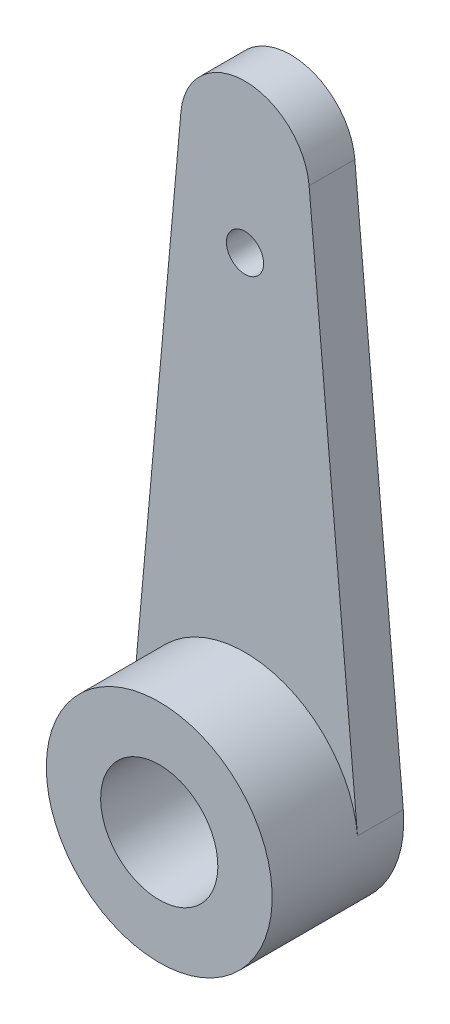
ISO-10303-21;
HEADER;
FILE_DESCRIPTION(('STEP AP214'),'2;1');
FILE_NAME('part.step','',(''),(''),'','','');
FILE_SCHEMA(('AUTOMOTIVE_DESIGN { 1 0 10303 214 1 1 1 1 }'));
ENDSEC;
DATA;
#1=APPLICATION_CONTEXT('core data for automotive mechanical design processes');
#2=APPLICATION_PROTOCOL_DEFINITION('international standard','automotive_design',2000,#1);
#3=PRODUCT_CONTEXT('',#1,'mechanical');
#4=PRODUCT('Part','Part','',(#3));
#5=PRODUCT_RELATED_PRODUCT_CATEGORY('part','',(#4));
#6=PRODUCT_DEFINITION_FORMATION('','',#4);
#7=PRODUCT_DEFINITION_CONTEXT('part definition',#1,'design');
#8=PRODUCT_DEFINITION('design','',#6,#7);
#9=PRODUCT_DEFINITION_SHAPE('','',#8);
#10=(LENGTH_UNIT() NAMED_UNIT(*) SI_UNIT(.MILLI.,.METRE.));
#11=(NAMED_UNIT(*) PLANE_ANGLE_UNIT() SI_UNIT($,.RADIAN.));
#12=(NAMED_UNIT(*) SI_UNIT($,.STERADIAN.) SOLID_ANGLE_UNIT());
#13=UNCERTAINTY_MEASURE_WITH_UNIT(LENGTH_MEASURE(1.E-05),#10,'distance_accuracy_value','');
#14=(GEOMETRIC_REPRESENTATION_CONTEXT(3) GLOBAL_UNCERTAINTY_ASSIGNED_CONTEXT((#13)) GLOBAL_UNIT_ASSIGNED_CONTEXT((#10,
#11,#12)) REPRESENTATION_CONTEXT('',''));
#15=CARTESIAN_POINT('',(0.,0.,0.));
#16=DIRECTION('',(0.,0.,1.));
#17=DIRECTION('',(1.,0.,0.));
#18=AXIS2_PLACEMENT_3D('',#15,#16,#17);
#19=CARTESIAN_POINT('',(0.,0.,0.6));
#20=DIRECTION('',(0.,0.,1.));
#21=DIRECTION('',(0.,1.,0.));
#22=AXIS2_PLACEMENT_3D('',#19,#20,#21);
#23=CYLINDRICAL_SURFACE('',#22,2.05);
#24=CARTESIAN_POINT('',(0.,0.,4.6));
#25=DIRECTION('',(0.,0.,-1.));
#26=DIRECTION('',(0.,1.,0.));
#27=AXIS2_PLACEMENT_3D('',#24,#25,#26);
#28=CIRCLE('',#27,2.05);
#29=CARTESIAN_POINT('',(0.,2.05,4.6));
#30=VERTEX_POINT('',#29);
#31=EDGE_CURVE('E27',#30,#30,#28,.T.);
#32=ORIENTED_EDGE('',*,*,#31,.F.);
#33=EDGE_LOOP('',(#32));
#34=FACE_BOUND('',#33,.T.);
#35=CARTESIAN_POINT('',(0.,0.,1.6));
#36=DIRECTION('',(0.,0.,-1.));
#37=DIRECTION('',(0.,1.,0.));
#38=AXIS2_PLACEMENT_3D('',#35,#36,#37);
#39=CIRCLE('',#38,2.05);
#40=CARTESIAN_POINT('',(0.,2.05,1.6));
#41=VERTEX_POINT('',#40);
#42=EDGE_CURVE('E11',#41,#41,#39,.T.);
#43=ORIENTED_EDGE('',*,*,#42,.T.);
#44=EDGE_LOOP('',(#43));
#45=FACE_BOUND('',#44,.T.);
#46=ADVANCED_FACE('F16',(#34,#45),#23,.F.);
#47=CARTESIAN_POINT('',(0.,0.,1.6));
#48=DIRECTION('',(0.,0.,1.));
#49=DIRECTION('',(1.,0.,0.));
#50=AXIS2_PLACEMENT_3D('',#47,#48,#49);
#51=PLANE('',#50);
#52=CARTESIAN_POINT('',(0.,0.,1.6));
#53=DIRECTION('',(0.,0.,-1.));
#54=DIRECTION('',(0.,1.,0.));
#55=AXIS2_PLACEMENT_3D('',#52,#53,#54);
#56=CIRCLE('',#55,1.3);
#57=CARTESIAN_POINT('',(0.,1.3,1.6));
#58=VERTEX_POINT('',#57);
#59=EDGE_CURVE('E156',#58,#58,#56,.T.);
#60=ORIENTED_EDGE('',*,*,#59,.T.);
#61=EDGE_LOOP('',(#60));
#62=FACE_BOUND('',#61,.T.);
#63=ORIENTED_EDGE('',*,*,#42,.F.);
#64=EDGE_LOOP('',(#63));
#65=FACE_BOUND('',#64,.T.);
#66=ADVANCED_FACE('F244',(#62,#65),#51,.T.);
#67=CARTESIAN_POINT('',(0.,0.,4.6));
#68=DIRECTION('',(0.,0.,1.));
#69=DIRECTION('',(1.,0.,0.));
#70=AXIS2_PLACEMENT_3D('',#67,#68,#69);
#71=PLANE('',#70);
#72=ORIENTED_EDGE('',*,*,#31,.T.);
#73=EDGE_LOOP('',(#72));
#74=FACE_BOUND('',#73,.T.);
#75=CARTESIAN_POINT('',(0.,0.,4.6));
#76=DIRECTION('',(0.,0.,1.));
#77=DIRECTION('',(-1.,0.,0.));
#78=AXIS2_PLACEMENT_3D('',#75,#76,#77);
#79=CIRCLE('',#78,3.95);
#80=CARTESIAN_POINT('',(-3.95,0.,4.6));
#81=VERTEX_POINT('',#80);
#82=EDGE_CURVE('E20',#81,#81,#79,.T.);
#83=ORIENTED_EDGE('',*,*,#82,.T.);
#84=EDGE_LOOP('',(#83));
#85=FACE_BOUND('',#84,.T.);
#86=ADVANCED_FACE('F238',(#74,#85),#71,.T.);
#87=CARTESIAN_POINT('',(0.,0.,0.));
#88=DIRECTION('',(0.,0.,1.));
#89=DIRECTION('',(0.,1.,0.));
#90=AXIS2_PLACEMENT_3D('',#87,#88,#89);
#91=CYLINDRICAL_SURFACE('',#90,1.3);
#92=ORIENTED_EDGE('',*,*,#59,.F.);
#93=EDGE_LOOP('',(#92));
#94=FACE_BOUND('',#93,.T.);
#95=CARTESIAN_POINT('',(0.,0.,0.));
#96=DIRECTION('',(0.,0.,1.));
#97=DIRECTION('',(0.,1.,0.));
#98=AXIS2_PLACEMENT_3D('',#95,#96,#97);
#99=CIRCLE('',#98,1.3);
#100=CARTESIAN_POINT('',(0.,1.3,0.));
#101=VERTEX_POINT('',#100);
#102=EDGE_CURVE('E149',#101,#101,#99,.T.);
#103=ORIENTED_EDGE('',*,*,#102,.F.);
#104=EDGE_LOOP('',(#103));
#105=FACE_BOUND('',#104,.T.);
#106=ADVANCED_FACE('F243',(#94,#105),#91,.F.);
#107=CARTESIAN_POINT('',(-2.24097566986092,19.2013157894737,0.));
#108=DIRECTION('',(-0.995989186604852,0.0894736842105264,0.));
#109=DIRECTION('',(0.,0.,1.));
#110=AXIS2_PLACEMENT_3D('',#107,#108,#109);
#111=PLANE('',#110);
#112=DIRECTION('',(-0.0894736842105264,-0.995989186604852,0.));
#113=VECTOR('',#112,1.);
#114=CARTESIAN_POINT('',(-2.24097566986092,19.2013157894737,0.));
#115=LINE('',#114,#113);
#116=CARTESIAN_POINT('',(-2.24097566986091,19.2013157894737,0.));
#117=VERTEX_POINT('',#116);
#118=CARTESIAN_POINT('',(-3.93415728708917,0.353421052631578,0.));
#119=VERTEX_POINT('',#118);
#120=EDGE_CURVE('E148',#117,#119,#115,.T.);
#121=ORIENTED_EDGE('',*,*,#120,.T.);
#122=DIRECTION('',(0.,0.,1.));
#123=VECTOR('',#122,1.);
#124=CARTESIAN_POINT('',(-3.93415728708917,0.353421052631579,0.));
#125=LINE('',#124,#123);
#126=CARTESIAN_POINT('',(-3.93415728708917,0.35342105263158,1.6));
#127=VERTEX_POINT('',#126);
#128=EDGE_CURVE('E107',#119,#127,#125,.T.);
#129=ORIENTED_EDGE('',*,*,#128,.T.);
#130=DIRECTION('',(-0.0894736842105264,-0.995989186604852,0.));
#131=VECTOR('',#130,1.);
#132=CARTESIAN_POINT('',(-2.24097566986092,19.2013157894737,1.6));
#133=LINE('',#132,#131);
#134=CARTESIAN_POINT('',(-2.24097566986091,19.2013157894737,1.6));
#135=VERTEX_POINT('',#134);
#136=EDGE_CURVE('E131',#135,#127,#133,.T.);
#137=ORIENTED_EDGE('',*,*,#136,.F.);
#138=DIRECTION('',(0.,0.,1.));
#139=VECTOR('',#138,1.);
#140=CARTESIAN_POINT('',(-2.24097566986091,19.2013157894737,0.));
#141=LINE('',#140,#139);
#142=EDGE_CURVE('E97',#117,#135,#141,.T.);
#143=ORIENTED_EDGE('',*,*,#142,.F.);
#144=EDGE_LOOP('',(#121,#129,#137,#143));
#145=FACE_BOUND('',#144,.T.);
#146=ADVANCED_FACE('F280',(#145),#111,.T.);
#147=CARTESIAN_POINT('',(0.,19.,0.));
#148=DIRECTION('',(0.,0.,1.));
#149=DIRECTION('',(0.995989186604852,0.0894736842105268,0.));
#150=AXIS2_PLACEMENT_3D('',#147,#148,#149);
#151=CYLINDRICAL_SURFACE('',#150,2.25);
#152=CARTESIAN_POINT('',(0.,19.,0.));
#153=DIRECTION('',(0.,0.,1.));
#154=DIRECTION('',(0.995989186604852,0.0894736842105269,0.));
#155=AXIS2_PLACEMENT_3D('',#152,#153,#154);
#156=CIRCLE('',#155,2.25);
#157=CARTESIAN_POINT('',(2.24097566986092,19.2013157894737,0.));
#158=VERTEX_POINT('',#157);
#159=EDGE_CURVE('E145',#158,#117,#156,.T.);
#160=ORIENTED_EDGE('',*,*,#159,.T.);
#161=ORIENTED_EDGE('',*,*,#142,.T.);
#162=CARTESIAN_POINT('',(0.,19.,1.6));
#163=DIRECTION('',(0.,0.,1.));
#164=DIRECTION('',(0.995989186604852,0.0894736842105269,0.));
#165=AXIS2_PLACEMENT_3D('',#162,#163,#164);
#166=CIRCLE('',#165,2.25);
#167=CARTESIAN_POINT('',(2.24097566986092,19.2013157894737,1.6));
#168=VERTEX_POINT('',#167);
#169=EDGE_CURVE('E127',#168,#135,#166,.T.);
#170=ORIENTED_EDGE('',*,*,#169,.F.);
#171=DIRECTION('',(0.,0.,1.));
#172=VECTOR('',#171,1.);
#173=CARTESIAN_POINT('',(2.24097566986092,19.2013157894737,0.));
#174=LINE('',#173,#172);
#175=EDGE_CURVE('E115',#158,#168,#174,.T.);
#176=ORIENTED_EDGE('',*,*,#175,.F.);
#177=EDGE_LOOP('',(#160,#161,#170,#176));
#178=FACE_BOUND('',#177,.T.);
#179=ADVANCED_FACE('F128',(#178),#151,.T.);
#180=CARTESIAN_POINT('',(3.93415728708917,0.353421052631579,0.));
#181=DIRECTION('',(0.995989186604852,0.0894736842105262,0.));
#182=DIRECTION('',(0.,0.,-1.));
#183=AXIS2_PLACEMENT_3D('',#180,#181,#182);
#184=PLANE('',#183);
#185=DIRECTION('',(-0.0894736842105262,0.995989186604852,0.));
#186=VECTOR('',#185,1.);
#187=CARTESIAN_POINT('',(3.93415728708917,0.353421052631579,0.));
#188=LINE('',#187,#186);
#189=CARTESIAN_POINT('',(3.93415728708917,0.353421052631577,0.));
#190=VERTEX_POINT('',#189);
#191=EDGE_CURVE('E122',#190,#158,#188,.T.);
#192=ORIENTED_EDGE('',*,*,#191,.T.);
#193=ORIENTED_EDGE('',*,*,#175,.T.);
#194=DIRECTION('',(-0.0894736842105262,0.995989186604852,0.));
#195=VECTOR('',#194,1.);
#196=CARTESIAN_POINT('',(3.93415728708917,0.353421052631579,1.6));
#197=LINE('',#196,#195);
#198=CARTESIAN_POINT('',(3.93415728708917,0.353421052631576,1.6));
#199=VERTEX_POINT('',#198);
#200=EDGE_CURVE('E119',#199,#168,#197,.T.);
#201=ORIENTED_EDGE('',*,*,#200,.F.);
#202=DIRECTION('',(0.,0.,1.));
#203=VECTOR('',#202,1.);
#204=CARTESIAN_POINT('',(3.93415728708917,0.353421052631576,0.));
#205=LINE('',#204,#203);
#206=EDGE_CURVE('E54',#190,#199,#205,.T.);
#207=ORIENTED_EDGE('',*,*,#206,.F.);
#208=EDGE_LOOP('',(#192,#193,#201,#207));
#209=FACE_BOUND('',#208,.T.);
#210=ADVANCED_FACE('F117',(#209),#184,.T.);
#211=CARTESIAN_POINT('',(0.,0.,0.));
#212=DIRECTION('',(0.,0.,1.));
#213=DIRECTION('',(-1.,0.,0.));
#214=AXIS2_PLACEMENT_3D('',#211,#212,#213);
#215=CYLINDRICAL_SURFACE('',#214,3.95);
#216=CARTESIAN_POINT('',(0.,0.,1.6));
#217=DIRECTION('',(0.,0.,-1.));
#218=DIRECTION('',(0.995989186604852,0.0894736842105249,0.));
#219=AXIS2_PLACEMENT_3D('',#216,#217,#218);
#220=CIRCLE('',#219,3.95);
#221=EDGE_CURVE('E134',#127,#199,#220,.T.);
#222=ORIENTED_EDGE('',*,*,#221,.F.);
#223=ORIENTED_EDGE('',*,*,#128,.F.);
#224=CARTESIAN_POINT('',(0.,0.,0.));
#225=DIRECTION('',(0.,0.,1.));
#226=DIRECTION('',(-0.995989186604852,0.0894736842105256,0.));
#227=AXIS2_PLACEMENT_3D('',#224,#225,#226);
#228=CIRCLE('',#227,3.95);
#229=CARTESIAN_POINT('',(-3.95,0.,0.));
#230=VERTEX_POINT('',#229);
#231=EDGE_CURVE('E173',#119,#230,#228,.T.);
#232=ORIENTED_EDGE('',*,*,#231,.T.);
#233=CARTESIAN_POINT('',(0.,0.,0.));
#234=DIRECTION('',(0.,0.,1.));
#235=DIRECTION('',(-1.,0.,0.));
#236=AXIS2_PLACEMENT_3D('',#233,#234,#235);
#237=CIRCLE('',#236,3.95);
#238=EDGE_CURVE('E161',#230,#190,#237,.T.);
#239=ORIENTED_EDGE('',*,*,#238,.T.);
#240=ORIENTED_EDGE('',*,*,#206,.T.);
#241=EDGE_LOOP('',(#222,#223,#232,#239,#240));
#242=FACE_BOUND('',#241,.T.);
#243=ORIENTED_EDGE('',*,*,#82,.F.);
#244=EDGE_LOOP('',(#243));
#245=FACE_BOUND('',#244,.T.);
#246=ADVANCED_FACE('F18',(#242,#245),#215,.T.);
#247=CARTESIAN_POINT('',(0.,16.05,4.6));
#248=DIRECTION('',(0.,0.,-1.));
#249=DIRECTION('',(0.,1.,0.));
#250=AXIS2_PLACEMENT_3D('',#247,#248,#249);
#251=CYLINDRICAL_SURFACE('',#250,0.65);
#252=CARTESIAN_POINT('',(0.,16.05,1.6));
#253=DIRECTION('',(0.,0.,-1.));
#254=DIRECTION('',(0.,1.,0.));
#255=AXIS2_PLACEMENT_3D('',#252,#253,#254);
#256=CIRCLE('',#255,0.65);
#257=CARTESIAN_POINT('',(0.,16.7,1.6));
#258=VERTEX_POINT('',#257);
#259=EDGE_CURVE('E69',#258,#258,#256,.T.);
#260=ORIENTED_EDGE('',*,*,#259,.F.);
#261=EDGE_LOOP('',(#260));
#262=FACE_BOUND('',#261,.T.);
#263=CARTESIAN_POINT('',(0.,16.05,0.));
#264=DIRECTION('',(0.,0.,1.));
#265=DIRECTION('',(0.,1.,0.));
#266=AXIS2_PLACEMENT_3D('',#263,#264,#265);
#267=CIRCLE('',#266,0.65);
#268=CARTESIAN_POINT('',(0.,16.7,0.));
#269=VERTEX_POINT('',#268);
#270=EDGE_CURVE('E83',#269,#269,#267,.T.);
#271=ORIENTED_EDGE('',*,*,#270,.F.);
#272=EDGE_LOOP('',(#271));
#273=FACE_BOUND('',#272,.T.);
#274=ADVANCED_FACE('F259',(#262,#273),#251,.F.);
#275=CARTESIAN_POINT('',(0.,0.,0.));
#276=DIRECTION('',(0.,0.,1.));
#277=DIRECTION('',(1.,0.,0.));
#278=AXIS2_PLACEMENT_3D('',#275,#276,#277);
#279=PLANE('',#278);
#280=ORIENTED_EDGE('',*,*,#102,.T.);
#281=EDGE_LOOP('',(#280));
#282=FACE_BOUND('',#281,.T.);
#283=ORIENTED_EDGE('',*,*,#270,.T.);
#284=EDGE_LOOP('',(#283));
#285=FACE_BOUND('',#284,.T.);
#286=ORIENTED_EDGE('',*,*,#191,.F.);
#287=ORIENTED_EDGE('',*,*,#238,.F.);
#288=ORIENTED_EDGE('',*,*,#231,.F.);
#289=ORIENTED_EDGE('',*,*,#120,.F.);
#290=ORIENTED_EDGE('',*,*,#159,.F.);
#291=EDGE_LOOP('',(#286,#287,#288,#289,#290));
#292=FACE_BOUND('',#291,.T.);
#293=ADVANCED_FACE('F233',(#282,#285,#292),#279,.F.);
#294=CARTESIAN_POINT('',(0.,0.,1.6));
#295=DIRECTION('',(0.,0.,1.));
#296=DIRECTION('',(1.,0.,0.));
#297=AXIS2_PLACEMENT_3D('',#294,#295,#296);
#298=PLANE('',#297);
#299=ORIENTED_EDGE('',*,*,#259,.T.);
#300=EDGE_LOOP('',(#299));
#301=FACE_BOUND('',#300,.T.);
#302=ORIENTED_EDGE('',*,*,#221,.T.);
#303=ORIENTED_EDGE('',*,*,#200,.T.);
#304=ORIENTED_EDGE('',*,*,#169,.T.);
#305=ORIENTED_EDGE('',*,*,#136,.T.);
#306=EDGE_LOOP('',(#302,#303,#304,#305));
#307=FACE_BOUND('',#306,.T.);
#308=ADVANCED_FACE('F133',(#301,#307),#298,.T.);
#309=CLOSED_SHELL('',(#46,#66,#86,#106,#146,#179,#210,#246,#274,#293,#308));
#310=MANIFOLD_SOLID_BREP('B1',#309);
#311=ADVANCED_BREP_SHAPE_REPRESENTATION('',(#18,#310),#14);
#312=SHAPE_DEFINITION_REPRESENTATION(#9,#311);
ENDSEC;
END-ISO-10303-21;
